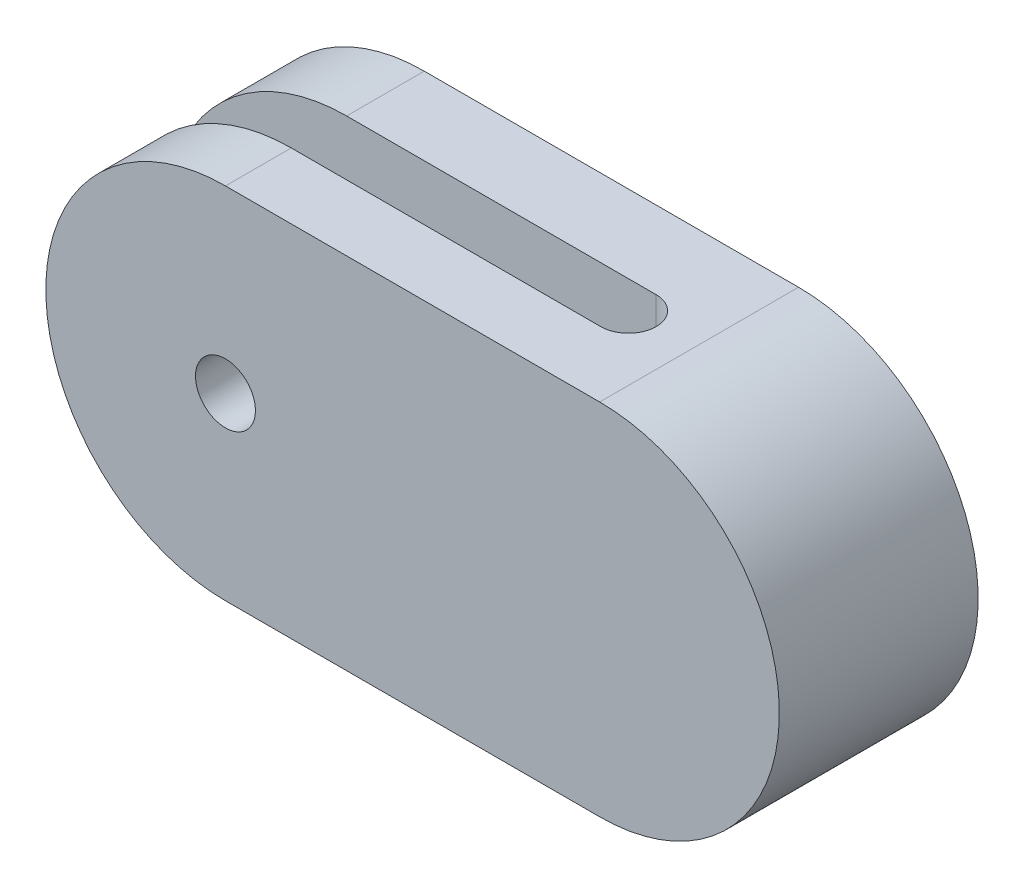
ISO-10303-21;
HEADER;
FILE_DESCRIPTION(('STEP AP214'),'2;1');
FILE_NAME('part.step','',(''),(''),'','','');
FILE_SCHEMA(('AUTOMOTIVE_DESIGN { 1 0 10303 214 1 1 1 1 }'));
ENDSEC;
DATA;
#1=APPLICATION_CONTEXT('core data for automotive mechanical design processes');
#2=APPLICATION_PROTOCOL_DEFINITION('international standard','automotive_design',2000,#1);
#3=PRODUCT_CONTEXT('',#1,'mechanical');
#4=PRODUCT('Part','Part','',(#3));
#5=PRODUCT_RELATED_PRODUCT_CATEGORY('part','',(#4));
#6=PRODUCT_DEFINITION_FORMATION('','',#4);
#7=PRODUCT_DEFINITION_CONTEXT('part definition',#1,'design');
#8=PRODUCT_DEFINITION('design','',#6,#7);
#9=PRODUCT_DEFINITION_SHAPE('','',#8);
#10=(LENGTH_UNIT() NAMED_UNIT(*) SI_UNIT(.MILLI.,.METRE.));
#11=(NAMED_UNIT(*) PLANE_ANGLE_UNIT() SI_UNIT($,.RADIAN.));
#12=(NAMED_UNIT(*) SI_UNIT($,.STERADIAN.) SOLID_ANGLE_UNIT());
#13=UNCERTAINTY_MEASURE_WITH_UNIT(LENGTH_MEASURE(1.E-05),#10,'distance_accuracy_value','');
#14=(GEOMETRIC_REPRESENTATION_CONTEXT(3) GLOBAL_UNCERTAINTY_ASSIGNED_CONTEXT((#13)) GLOBAL_UNIT_ASSIGNED_CONTEXT((#10,
#11,#12)) REPRESENTATION_CONTEXT('',''));
#15=CARTESIAN_POINT('',(0.,0.,0.));
#16=DIRECTION('',(0.,0.,1.));
#17=DIRECTION('',(1.,0.,0.));
#18=AXIS2_PLACEMENT_3D('',#15,#16,#17);
#19=CARTESIAN_POINT('',(10.3123999999999,-14.5500000000001,29.7785457314076));
#20=DIRECTION('',(0.,0.,-1.));
#21=DIRECTION('',(-1.,0.,0.));
#22=AXIS2_PLACEMENT_3D('',#19,#20,#21);
#23=CYLINDRICAL_SURFACE('',#22,6.);
#24=DIRECTION('',(0.,0.,-1.));
#25=VECTOR('',#24,1.);
#26=CARTESIAN_POINT('',(10.3123999999999,-8.55000000000005,29.7785457314076));
#27=LINE('',#26,#25);
#28=CARTESIAN_POINT('',(10.3123999999999,-8.55000000000005,2.34760000000009));
#29=VERTEX_POINT('',#28);
#30=CARTESIAN_POINT('',(10.3123999999999,-8.55000000000005,0.150000000000015));
#31=VERTEX_POINT('',#30);
#32=EDGE_CURVE('E158',#29,#31,#27,.T.);
#33=ORIENTED_EDGE('',*,*,#32,.T.);
#34=CARTESIAN_POINT('',(10.3123999999999,-14.5500000000001,0.150000000000015));
#35=DIRECTION('',(0.,0.,1.));
#36=DIRECTION('',(1.,0.,0.));
#37=AXIS2_PLACEMENT_3D('',#34,#35,#36);
#38=CIRCLE('',#37,6.);
#39=CARTESIAN_POINT('',(10.3123999999999,-20.5500000000001,0.150000000000015));
#40=VERTEX_POINT('',#39);
#41=EDGE_CURVE('E135',#31,#40,#38,.T.);
#42=ORIENTED_EDGE('',*,*,#41,.T.);
#43=DIRECTION('',(0.,0.,-1.));
#44=VECTOR('',#43,1.);
#45=CARTESIAN_POINT('',(10.3123999999999,-20.5500000000001,29.7785457314076));
#46=LINE('',#45,#44);
#47=CARTESIAN_POINT('',(10.3123999999999,-20.5500000000001,2.34760000000013));
#48=VERTEX_POINT('',#47);
#49=EDGE_CURVE('E155',#48,#40,#46,.T.);
#50=ORIENTED_EDGE('',*,*,#49,.F.);
#51=CARTESIAN_POINT('',(10.3123999999999,-14.5500000000001,2.34760000000011));
#52=DIRECTION('',(0.,0.,-1.));
#53=DIRECTION('',(0.,1.,0.));
#54=AXIS2_PLACEMENT_3D('',#51,#52,#53);
#55=CIRCLE('',#54,6.);
#56=EDGE_CURVE('E151',#48,#29,#55,.T.);
#57=ORIENTED_EDGE('',*,*,#56,.T.);
#58=EDGE_LOOP('',(#33,#42,#50,#57));
#59=FACE_BOUND('',#58,.T.);
#60=ADVANCED_FACE('F38',(#59),#23,.T.);
#61=CARTESIAN_POINT('',(10.3123999999999,-14.5500000000001,-1.69999999999998));
#62=DIRECTION('',(0.,0.,-1.));
#63=DIRECTION('',(-1.,0.,0.));
#64=AXIS2_PLACEMENT_3D('',#61,#62,#63);
#65=CIRCLE('',#64,6.);
#66=CARTESIAN_POINT('',(10.3123999999999,-20.5500000000001,-1.69999999999998));
#67=VERTEX_POINT('',#66);
#68=CARTESIAN_POINT('',(10.3123999999999,-8.55000000000005,-1.69999999999999));
#69=VERTEX_POINT('',#68);
#70=EDGE_CURVE('E53',#67,#69,#65,.T.);
#71=ORIENTED_EDGE('',*,*,#70,.T.);
#72=CARTESIAN_POINT('',(10.3123999999999,-8.55000000000005,-4.29299999999977));
#73=VERTEX_POINT('',#72);
#74=EDGE_CURVE('E121',#69,#73,#27,.T.);
#75=ORIENTED_EDGE('',*,*,#74,.T.);
#76=CARTESIAN_POINT('',(10.3123999999999,-14.5500000000001,-4.29299999999975));
#77=DIRECTION('',(0.,0.,1.));
#78=DIRECTION('',(1.,0.,0.));
#79=AXIS2_PLACEMENT_3D('',#76,#77,#78);
#80=CIRCLE('',#79,6.);
#81=CARTESIAN_POINT('',(10.3123999999999,-20.5500000000001,-4.29299999999973));
#82=VERTEX_POINT('',#81);
#83=EDGE_CURVE('E139',#82,#73,#80,.F.);
#84=ORIENTED_EDGE('',*,*,#83,.F.);
#85=EDGE_CURVE('E148',#67,#82,#46,.T.);
#86=ORIENTED_EDGE('',*,*,#85,.F.);
#87=EDGE_LOOP('',(#71,#75,#84,#86));
#88=FACE_BOUND('',#87,.T.);
#89=ADVANCED_FACE('F183',(#88),#23,.T.);
#90=CARTESIAN_POINT('',(10.3123999999999,-8.55000000000005,29.7785457314076));
#91=DIRECTION('',(0.,1.,0.));
#92=DIRECTION('',(0.,0.,1.));
#93=AXIS2_PLACEMENT_3D('',#90,#91,#92);
#94=PLANE('',#93);
#95=DIRECTION('',(-1.,0.,0.));
#96=VECTOR('',#95,1.);
#97=CARTESIAN_POINT('',(4.31239999999993,-8.55000000000005,0.150000000000014));
#98=LINE('',#97,#96);
#99=CARTESIAN_POINT('',(20.65,-8.55000000000005,0.150000000000016));
#100=VERTEX_POINT('',#99);
#101=EDGE_CURVE('E110',#100,#31,#98,.T.);
#102=ORIENTED_EDGE('',*,*,#101,.T.);
#103=ORIENTED_EDGE('',*,*,#32,.F.);
#104=DIRECTION('',(-1.,0.,0.));
#105=VECTOR('',#104,1.);
#106=CARTESIAN_POINT('',(10.3123999999999,-8.55000000000005,2.34760000000008));
#107=LINE('',#106,#105);
#108=CARTESIAN_POINT('',(22.8123999999999,-8.55000000000005,2.34760000000009));
#109=VERTEX_POINT('',#108);
#110=EDGE_CURVE('E149',#109,#29,#107,.T.);
#111=ORIENTED_EDGE('',*,*,#110,.F.);
#112=DIRECTION('',(0.,0.,-1.));
#113=VECTOR('',#112,1.);
#114=CARTESIAN_POINT('',(22.8123999999999,-8.55000000000005,29.7785457314076));
#115=LINE('',#114,#113);
#116=CARTESIAN_POINT('',(22.8123999999999,-8.55000000000005,-4.29299999999987));
#117=VERTEX_POINT('',#116);
#118=EDGE_CURVE('E161',#109,#117,#115,.T.);
#119=ORIENTED_EDGE('',*,*,#118,.T.);
#120=DIRECTION('',(-1.,0.,0.));
#121=VECTOR('',#120,1.);
#122=CARTESIAN_POINT('',(10.3124000000001,-8.55000000000005,-4.29299999999977));
#123=LINE('',#122,#121);
#124=EDGE_CURVE('E137',#117,#73,#123,.T.);
#125=ORIENTED_EDGE('',*,*,#124,.T.);
#126=ORIENTED_EDGE('',*,*,#74,.F.);
#127=DIRECTION('',(1.,0.,0.));
#128=VECTOR('',#127,1.);
#129=CARTESIAN_POINT('',(4.31239999999993,-8.55000000000005,-1.69999999999999));
#130=LINE('',#129,#128);
#131=CARTESIAN_POINT('',(20.65,-8.55000000000005,-1.69999999999999));
#132=VERTEX_POINT('',#131);
#133=EDGE_CURVE('E104',#69,#132,#130,.T.);
#134=ORIENTED_EDGE('',*,*,#133,.T.);
#135=CARTESIAN_POINT('',(20.65,-8.55000000000005,-0.774999999999986));
#136=DIRECTION('',(0.,-1.,0.));
#137=DIRECTION('',(0.,0.,-1.));
#138=AXIS2_PLACEMENT_3D('',#135,#136,#137);
#139=CIRCLE('',#138,0.925000000000003);
#140=EDGE_CURVE('E113',#132,#100,#139,.T.);
#141=ORIENTED_EDGE('',*,*,#140,.T.);
#142=EDGE_LOOP('',(#102,#103,#111,#119,#125,#126,#134,#141));
#143=FACE_BOUND('',#142,.T.);
#144=ADVANCED_FACE('F119',(#143),#94,.T.);
#145=CARTESIAN_POINT('',(22.8123999999999,-14.5500000000001,29.7785457314076));
#146=DIRECTION('',(0.,0.,-1.));
#147=DIRECTION('',(-1.,0.,0.));
#148=AXIS2_PLACEMENT_3D('',#145,#146,#147);
#149=CYLINDRICAL_SURFACE('',#148,6.);
#150=ORIENTED_EDGE('',*,*,#118,.F.);
#151=CARTESIAN_POINT('',(22.8123999999999,-14.5500000000001,2.34760000000011));
#152=DIRECTION('',(0.,0.,-1.));
#153=DIRECTION('',(0.,1.,0.));
#154=AXIS2_PLACEMENT_3D('',#151,#152,#153);
#155=CIRCLE('',#154,6.);
#156=CARTESIAN_POINT('',(22.8123999999999,-20.5500000000001,2.34760000000013));
#157=VERTEX_POINT('',#156);
#158=EDGE_CURVE('E60',#109,#157,#155,.T.);
#159=ORIENTED_EDGE('',*,*,#158,.T.);
#160=DIRECTION('',(0.,0.,-1.));
#161=VECTOR('',#160,1.);
#162=CARTESIAN_POINT('',(22.8123999999999,-20.5500000000001,29.7785457314076));
#163=LINE('',#162,#161);
#164=CARTESIAN_POINT('',(22.8123999999999,-20.5500000000001,-4.29299999999981));
#165=VERTEX_POINT('',#164);
#166=EDGE_CURVE('E163',#157,#165,#163,.T.);
#167=ORIENTED_EDGE('',*,*,#166,.T.);
#168=CARTESIAN_POINT('',(22.8123999999999,-14.5500000000001,-4.29299999999983));
#169=DIRECTION('',(0.,0.,1.));
#170=DIRECTION('',(1.,0.,0.));
#171=AXIS2_PLACEMENT_3D('',#168,#169,#170);
#172=CIRCLE('',#171,6.);
#173=EDGE_CURVE('E145',#117,#165,#172,.F.);
#174=ORIENTED_EDGE('',*,*,#173,.F.);
#175=EDGE_LOOP('',(#150,#159,#167,#174));
#176=FACE_BOUND('',#175,.T.);
#177=ADVANCED_FACE('F176',(#176),#149,.T.);
#178=CARTESIAN_POINT('',(10.3123999999999,-20.5500000000001,29.7785457314076));
#179=DIRECTION('',(0.,1.,0.));
#180=DIRECTION('',(0.,0.,1.));
#181=AXIS2_PLACEMENT_3D('',#178,#179,#180);
#182=PLANE('',#181);
#183=ORIENTED_EDGE('',*,*,#49,.T.);
#184=DIRECTION('',(-1.,0.,0.));
#185=VECTOR('',#184,1.);
#186=CARTESIAN_POINT('',(4.31239999999993,-20.5500000000001,0.150000000000014));
#187=LINE('',#186,#185);
#188=CARTESIAN_POINT('',(20.65,-20.5500000000001,0.150000000000016));
#189=VERTEX_POINT('',#188);
#190=EDGE_CURVE('E122',#189,#40,#187,.T.);
#191=ORIENTED_EDGE('',*,*,#190,.F.);
#192=CARTESIAN_POINT('',(20.65,-20.5500000000001,-0.774999999999986));
#193=DIRECTION('',(0.,-1.,0.));
#194=DIRECTION('',(0.,0.,-1.));
#195=AXIS2_PLACEMENT_3D('',#192,#193,#194);
#196=CIRCLE('',#195,0.925000000000003);
#197=CARTESIAN_POINT('',(20.65,-20.5500000000001,-1.69999999999999));
#198=VERTEX_POINT('',#197);
#199=EDGE_CURVE('E125',#198,#189,#196,.T.);
#200=ORIENTED_EDGE('',*,*,#199,.F.);
#201=DIRECTION('',(-1.,0.,0.));
#202=VECTOR('',#201,1.);
#203=CARTESIAN_POINT('',(10.3123999999999,-20.5500000000001,-1.69999999999998));
#204=LINE('',#203,#202);
#205=EDGE_CURVE('E12',#198,#67,#204,.T.);
#206=ORIENTED_EDGE('',*,*,#205,.T.);
#207=ORIENTED_EDGE('',*,*,#85,.T.);
#208=DIRECTION('',(-1.,0.,0.));
#209=VECTOR('',#208,1.);
#210=CARTESIAN_POINT('',(10.3124000000001,-20.5500000000001,-4.29299999999973));
#211=LINE('',#210,#209);
#212=EDGE_CURVE('E142',#165,#82,#211,.T.);
#213=ORIENTED_EDGE('',*,*,#212,.F.);
#214=ORIENTED_EDGE('',*,*,#166,.F.);
#215=DIRECTION('',(-1.,0.,0.));
#216=VECTOR('',#215,1.);
#217=CARTESIAN_POINT('',(10.3123999999999,-20.5500000000001,2.34760000000013));
#218=LINE('',#217,#216);
#219=EDGE_CURVE('E46',#157,#48,#218,.T.);
#220=ORIENTED_EDGE('',*,*,#219,.T.);
#221=EDGE_LOOP('',(#183,#191,#200,#206,#207,#213,#214,#220));
#222=FACE_BOUND('',#221,.T.);
#223=ADVANCED_FACE('F40',(#222),#182,.F.);
#224=CARTESIAN_POINT('',(0.,-14.55,2.3476000000001));
#225=DIRECTION('',(0.,0.,-1.));
#226=DIRECTION('',(-1.,0.,0.));
#227=AXIS2_PLACEMENT_3D('',#224,#225,#226);
#228=PLANE('',#227);
#229=CARTESIAN_POINT('',(10.3123999999999,-14.5500000000001,2.34760000000013));
#230=DIRECTION('',(0.,0.,-1.));
#231=DIRECTION('',(-1.,0.,0.));
#232=AXIS2_PLACEMENT_3D('',#229,#230,#231);
#233=CIRCLE('',#232,1.);
#234=CARTESIAN_POINT('',(9.3123999999999,-14.5500000000001,2.34760000000013));
#235=VERTEX_POINT('',#234);
#236=EDGE_CURVE('E292',#235,#235,#233,.T.);
#237=ORIENTED_EDGE('',*,*,#236,.T.);
#238=EDGE_LOOP('',(#237));
#239=FACE_BOUND('',#238,.T.);
#240=ORIENTED_EDGE('',*,*,#158,.F.);
#241=ORIENTED_EDGE('',*,*,#110,.T.);
#242=ORIENTED_EDGE('',*,*,#56,.F.);
#243=ORIENTED_EDGE('',*,*,#219,.F.);
#244=EDGE_LOOP('',(#240,#241,#242,#243));
#245=FACE_BOUND('',#244,.T.);
#246=ADVANCED_FACE('F168',(#239,#245),#228,.F.);
#247=CARTESIAN_POINT('',(114.9724,-14.5500000000001,-4.29300000000045));
#248=DIRECTION('',(0.,0.,1.));
#249=DIRECTION('',(0.,1.,0.));
#250=AXIS2_PLACEMENT_3D('',#247,#248,#249);
#251=PLANE('',#250);
#252=CARTESIAN_POINT('',(10.3123999999999,-14.5500000000001,-4.29299999999975));
#253=DIRECTION('',(0.,0.,-1.));
#254=DIRECTION('',(-1.,0.,0.));
#255=AXIS2_PLACEMENT_3D('',#252,#253,#254);
#256=CIRCLE('',#255,1.575);
#257=CARTESIAN_POINT('',(8.7373999999999,-14.5500000000001,-4.29299999999974));
#258=VERTEX_POINT('',#257);
#259=EDGE_CURVE('E290',#258,#258,#256,.T.);
#260=ORIENTED_EDGE('',*,*,#259,.F.);
#261=EDGE_LOOP('',(#260));
#262=FACE_BOUND('',#261,.T.);
#263=ORIENTED_EDGE('',*,*,#212,.T.);
#264=ORIENTED_EDGE('',*,*,#83,.T.);
#265=ORIENTED_EDGE('',*,*,#124,.F.);
#266=ORIENTED_EDGE('',*,*,#173,.T.);
#267=EDGE_LOOP('',(#263,#264,#265,#266));
#268=FACE_BOUND('',#267,.T.);
#269=ADVANCED_FACE('F185',(#262,#268),#251,.F.);
#270=CARTESIAN_POINT('',(4.31239999999993,-8.55000000000005,0.150000000000014));
#271=DIRECTION('',(0.,0.,1.));
#272=DIRECTION('',(1.,0.,0.));
#273=AXIS2_PLACEMENT_3D('',#270,#271,#272);
#274=PLANE('',#273);
#275=CARTESIAN_POINT('',(10.3123999999999,-14.5500000000001,0.150000000000015));
#276=DIRECTION('',(0.,0.,-1.));
#277=DIRECTION('',(-1.,0.,0.));
#278=AXIS2_PLACEMENT_3D('',#275,#276,#277);
#279=CIRCLE('',#278,1.);
#280=CARTESIAN_POINT('',(9.3123999999999,-14.5500000000001,0.150000000000014));
#281=VERTEX_POINT('',#280);
#282=EDGE_CURVE('E295',#281,#281,#279,.T.);
#283=ORIENTED_EDGE('',*,*,#282,.F.);
#284=EDGE_LOOP('',(#283));
#285=FACE_BOUND('',#284,.T.);
#286=ORIENTED_EDGE('',*,*,#101,.F.);
#287=DIRECTION('',(0.,-1.,0.));
#288=VECTOR('',#287,1.);
#289=CARTESIAN_POINT('',(20.65,-8.55000000000005,0.150000000000016));
#290=LINE('',#289,#288);
#291=EDGE_CURVE('E109',#100,#189,#290,.T.);
#292=ORIENTED_EDGE('',*,*,#291,.T.);
#293=ORIENTED_EDGE('',*,*,#190,.T.);
#294=ORIENTED_EDGE('',*,*,#41,.F.);
#295=EDGE_LOOP('',(#286,#292,#293,#294));
#296=FACE_BOUND('',#295,.T.);
#297=ADVANCED_FACE('F179',(#285,#296),#274,.F.);
#298=CARTESIAN_POINT('',(4.31239999999993,-8.55000000000005,-1.69999999999999));
#299=DIRECTION('',(0.,0.,-1.));
#300=DIRECTION('',(-1.,0.,0.));
#301=AXIS2_PLACEMENT_3D('',#298,#299,#300);
#302=PLANE('',#301);
#303=CARTESIAN_POINT('',(10.3123999999999,-14.5500000000001,-1.69999999999999));
#304=DIRECTION('',(0.,0.,-1.));
#305=DIRECTION('',(-1.,0.,0.));
#306=AXIS2_PLACEMENT_3D('',#303,#304,#305);
#307=CIRCLE('',#306,1.575);
#308=CARTESIAN_POINT('',(8.73739999999992,-14.5500000000001,-1.69999999999999));
#309=VERTEX_POINT('',#308);
#310=EDGE_CURVE('E128',#309,#309,#307,.F.);
#311=ORIENTED_EDGE('',*,*,#310,.F.);
#312=EDGE_LOOP('',(#311));
#313=FACE_BOUND('',#312,.T.);
#314=ORIENTED_EDGE('',*,*,#70,.F.);
#315=ORIENTED_EDGE('',*,*,#205,.F.);
#316=DIRECTION('',(0.,-1.,0.));
#317=VECTOR('',#316,1.);
#318=CARTESIAN_POINT('',(20.65,-8.55000000000005,-1.69999999999999));
#319=LINE('',#318,#317);
#320=EDGE_CURVE('E100',#132,#198,#319,.T.);
#321=ORIENTED_EDGE('',*,*,#320,.F.);
#322=ORIENTED_EDGE('',*,*,#133,.F.);
#323=EDGE_LOOP('',(#314,#315,#321,#322));
#324=FACE_BOUND('',#323,.T.);
#325=ADVANCED_FACE('F102',(#313,#324),#302,.F.);
#326=CARTESIAN_POINT('',(20.65,-8.55000000000005,-0.774999999999986));
#327=DIRECTION('',(0.,-1.,0.));
#328=DIRECTION('',(0.,0.,-1.));
#329=AXIS2_PLACEMENT_3D('',#326,#327,#328);
#330=CYLINDRICAL_SURFACE('',#329,0.925000000000003);
#331=ORIENTED_EDGE('',*,*,#199,.T.);
#332=ORIENTED_EDGE('',*,*,#291,.F.);
#333=ORIENTED_EDGE('',*,*,#140,.F.);
#334=ORIENTED_EDGE('',*,*,#320,.T.);
#335=EDGE_LOOP('',(#331,#332,#333,#334));
#336=FACE_BOUND('',#335,.T.);
#337=ADVANCED_FACE('F114',(#336),#330,.F.);
#338=CARTESIAN_POINT('',(10.3123999999999,-14.55,2.75477272147525));
#339=DIRECTION('',(0.,0.,-1.));
#340=DIRECTION('',(-1.,0.,0.));
#341=AXIS2_PLACEMENT_3D('',#338,#339,#340);
#342=CYLINDRICAL_SURFACE('',#341,1.575);
#343=ORIENTED_EDGE('',*,*,#310,.T.);
#344=EDGE_LOOP('',(#343));
#345=FACE_BOUND('',#344,.T.);
#346=ORIENTED_EDGE('',*,*,#259,.T.);
#347=EDGE_LOOP('',(#346));
#348=FACE_BOUND('',#347,.T.);
#349=ADVANCED_FACE('F225',(#345,#348),#342,.F.);
#350=CARTESIAN_POINT('',(10.3123999999999,-14.5500000000001,2.34760000000013));
#351=DIRECTION('',(0.,0.,-1.));
#352=DIRECTION('',(-1.,0.,0.));
#353=AXIS2_PLACEMENT_3D('',#350,#351,#352);
#354=CYLINDRICAL_SURFACE('',#353,1.);
#355=ORIENTED_EDGE('',*,*,#236,.F.);
#356=EDGE_LOOP('',(#355));
#357=FACE_BOUND('',#356,.T.);
#358=ORIENTED_EDGE('',*,*,#282,.T.);
#359=EDGE_LOOP('',(#358));
#360=FACE_BOUND('',#359,.T.);
#361=ADVANCED_FACE('F239',(#357,#360),#354,.F.);
#362=CLOSED_SHELL('',(#60,#89,#144,#177,#223,#246,#269,#297,#325,#337,#349,#361));
#363=MANIFOLD_SOLID_BREP('B2',#362);
#364=ADVANCED_BREP_SHAPE_REPRESENTATION('',(#18,#363),#14);
#365=SHAPE_DEFINITION_REPRESENTATION(#9,#364);
ENDSEC;
END-ISO-10303-21;
